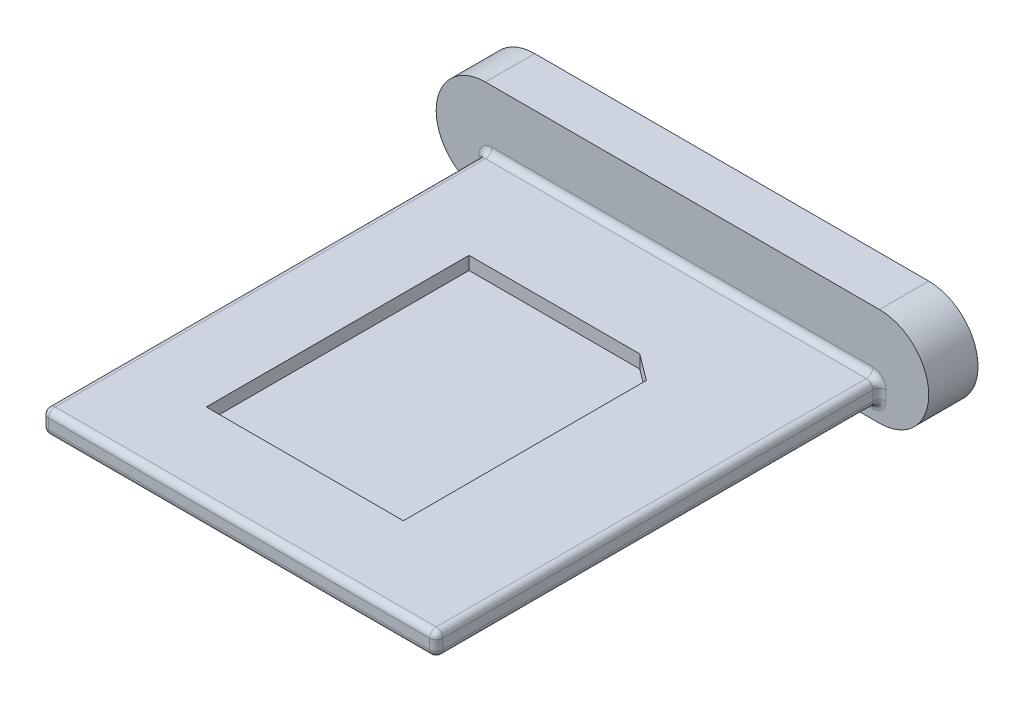
ISO-10303-21;
HEADER;
FILE_DESCRIPTION(('STEP AP214'),'2;1');
FILE_NAME('part.step','',(''),(''),'','','');
FILE_SCHEMA(('AUTOMOTIVE_DESIGN { 1 0 10303 214 1 1 1 1 }'));
ENDSEC;
DATA;
#1=APPLICATION_CONTEXT('core data for automotive mechanical design processes');
#2=APPLICATION_PROTOCOL_DEFINITION('international standard','automotive_design',2000,#1);
#3=PRODUCT_CONTEXT('',#1,'mechanical');
#4=PRODUCT('Part','Part','',(#3));
#5=PRODUCT_RELATED_PRODUCT_CATEGORY('part','',(#4));
#6=PRODUCT_DEFINITION_FORMATION('','',#4);
#7=PRODUCT_DEFINITION_CONTEXT('part definition',#1,'design');
#8=PRODUCT_DEFINITION('design','',#6,#7);
#9=PRODUCT_DEFINITION_SHAPE('','',#8);
#10=(LENGTH_UNIT() NAMED_UNIT(*) SI_UNIT(.MILLI.,.METRE.));
#11=(NAMED_UNIT(*) PLANE_ANGLE_UNIT() SI_UNIT($,.RADIAN.));
#12=(NAMED_UNIT(*) SI_UNIT($,.STERADIAN.) SOLID_ANGLE_UNIT());
#13=UNCERTAINTY_MEASURE_WITH_UNIT(LENGTH_MEASURE(1.E-05),#10,'distance_accuracy_value','');
#14=(GEOMETRIC_REPRESENTATION_CONTEXT(3) GLOBAL_UNCERTAINTY_ASSIGNED_CONTEXT((#13)) GLOBAL_UNIT_ASSIGNED_CONTEXT((#10,
#11,#12)) REPRESENTATION_CONTEXT('',''));
#15=CARTESIAN_POINT('',(0.,0.,0.));
#16=DIRECTION('',(0.,0.,1.));
#17=DIRECTION('',(1.,0.,0.));
#18=AXIS2_PLACEMENT_3D('',#15,#16,#17);
#19=CARTESIAN_POINT('',(-5.3717277486911,0.546879183106835,1.5));
#20=DIRECTION('',(0.,0.,1.));
#21=DIRECTION('',(1.,0.,0.));
#22=AXIS2_PLACEMENT_3D('',#19,#20,#21);
#23=PLANE('',#22);
#24=CARTESIAN_POINT('',(-5.3717277486911,0.546879183106835,1.5));
#25=DIRECTION('',(0.,0.,1.));
#26=DIRECTION('',(1.,0.,0.));
#27=AXIS2_PLACEMENT_3D('',#24,#25,#26);
#28=CIRCLE('',#27,1.5);
#29=CARTESIAN_POINT('',(-5.3717277486911,2.04687918310684,1.5));
#30=VERTEX_POINT('',#29);
#31=CARTESIAN_POINT('',(-5.3717277486911,-0.953120816893165,1.5));
#32=VERTEX_POINT('',#31);
#33=EDGE_CURVE('E265',#30,#32,#28,.T.);
#34=ORIENTED_EDGE('',*,*,#33,.T.);
#35=DIRECTION('',(1.,0.,0.));
#36=VECTOR('',#35,1.);
#37=CARTESIAN_POINT('',(-5.3717277486911,-0.953120816893165,1.5));
#38=LINE('',#37,#36);
#39=CARTESIAN_POINT('',(6.6282722513089,-0.953120816893165,1.5));
#40=VERTEX_POINT('',#39);
#41=EDGE_CURVE('E269',#32,#40,#38,.T.);
#42=ORIENTED_EDGE('',*,*,#41,.T.);
#43=CARTESIAN_POINT('',(6.6282722513089,0.546879183106835,1.5));
#44=DIRECTION('',(0.,0.,-1.));
#45=DIRECTION('',(-1.,0.,0.));
#46=AXIS2_PLACEMENT_3D('',#43,#44,#45);
#47=CIRCLE('',#46,1.5);
#48=CARTESIAN_POINT('',(6.6282722513089,2.04687918310684,1.5));
#49=VERTEX_POINT('',#48);
#50=EDGE_CURVE('E273',#49,#40,#47,.T.);
#51=ORIENTED_EDGE('',*,*,#50,.F.);
#52=DIRECTION('',(1.,0.,0.));
#53=VECTOR('',#52,1.);
#54=CARTESIAN_POINT('',(-5.3717277486911,2.04687918310684,1.5));
#55=LINE('',#54,#53);
#56=EDGE_CURVE('E277',#30,#49,#55,.T.);
#57=ORIENTED_EDGE('',*,*,#56,.F.);
#58=EDGE_LOOP('',(#34,#42,#51,#57));
#59=FACE_BOUND('',#58,.T.);
#60=CARTESIAN_POINT('',(6.4282722513089,0.0270542903007174,1.5));
#61=DIRECTION('',(0.,0.,1.));
#62=DIRECTION('',(1.,0.,0.));
#63=AXIS2_PLACEMENT_3D('',#60,#61,#62);
#64=CIRCLE('',#63,0.4);
#65=CARTESIAN_POINT('',(6.8282722513089,0.0270542903007174,1.5));
#66=VERTEX_POINT('',#65);
#67=CARTESIAN_POINT('',(6.4282722513089,0.427054290300717,1.5));
#68=VERTEX_POINT('',#67);
#69=EDGE_CURVE('E346',#66,#68,#64,.T.);
#70=ORIENTED_EDGE('',*,*,#69,.F.);
#71=DIRECTION('',(0.,1.,0.));
#72=VECTOR('',#71,1.);
#73=CARTESIAN_POINT('',(6.8282722513089,0.546879183106835,1.5));
#74=LINE('',#73,#72);
#75=CARTESIAN_POINT('',(6.8282722513089,-0.272945709699283,1.5));
#76=VERTEX_POINT('',#75);
#77=EDGE_CURVE('E343',#66,#76,#74,.F.);
#78=ORIENTED_EDGE('',*,*,#77,.T.);
#79=CARTESIAN_POINT('',(6.4282722513089,-0.272945709699283,1.5));
#80=DIRECTION('',(0.,0.,1.));
#81=DIRECTION('',(1.,0.,0.));
#82=AXIS2_PLACEMENT_3D('',#79,#80,#81);
#83=CIRCLE('',#82,0.4);
#84=CARTESIAN_POINT('',(6.4282722513089,-0.672945709699283,1.5));
#85=VERTEX_POINT('',#84);
#86=EDGE_CURVE('E339',#85,#76,#83,.T.);
#87=ORIENTED_EDGE('',*,*,#86,.F.);
#88=DIRECTION('',(1.,0.,0.));
#89=VECTOR('',#88,1.);
#90=CARTESIAN_POINT('',(-5.3717277486911,-0.672945709699283,1.5));
#91=LINE('',#90,#89);
#92=CARTESIAN_POINT('',(-5.1717277486911,-0.672945709699283,1.5));
#93=VERTEX_POINT('',#92);
#94=EDGE_CURVE('E332',#85,#93,#91,.F.);
#95=ORIENTED_EDGE('',*,*,#94,.T.);
#96=CARTESIAN_POINT('',(-5.1717277486911,-0.272945709699283,1.5));
#97=DIRECTION('',(0.,0.,1.));
#98=DIRECTION('',(1.,0.,0.));
#99=AXIS2_PLACEMENT_3D('',#96,#97,#98);
#100=CIRCLE('',#99,0.4);
#101=CARTESIAN_POINT('',(-5.5717277486911,-0.272945709699283,1.5));
#102=VERTEX_POINT('',#101);
#103=EDGE_CURVE('E328',#102,#93,#100,.T.);
#104=ORIENTED_EDGE('',*,*,#103,.F.);
#105=DIRECTION('',(0.,-1.,0.));
#106=VECTOR('',#105,1.);
#107=CARTESIAN_POINT('',(-5.5717277486911,0.546879183106835,1.5));
#108=LINE('',#107,#106);
#109=CARTESIAN_POINT('',(-5.5717277486911,0.0270542903007174,1.5));
#110=VERTEX_POINT('',#109);
#111=EDGE_CURVE('E325',#102,#110,#108,.F.);
#112=ORIENTED_EDGE('',*,*,#111,.T.);
#113=CARTESIAN_POINT('',(-5.1717277486911,0.0270542903007174,1.5));
#114=DIRECTION('',(0.,0.,1.));
#115=DIRECTION('',(1.,0.,0.));
#116=AXIS2_PLACEMENT_3D('',#113,#114,#115);
#117=CIRCLE('',#116,0.4);
#118=CARTESIAN_POINT('',(-5.1717277486911,0.427054290300717,1.5));
#119=VERTEX_POINT('',#118);
#120=EDGE_CURVE('E321',#119,#110,#117,.T.);
#121=ORIENTED_EDGE('',*,*,#120,.F.);
#122=DIRECTION('',(-1.,0.,0.));
#123=VECTOR('',#122,1.);
#124=CARTESIAN_POINT('',(-5.3717277486911,0.427054290300717,1.5));
#125=LINE('',#124,#123);
#126=EDGE_CURVE('E335',#119,#68,#125,.F.);
#127=ORIENTED_EDGE('',*,*,#126,.T.);
#128=EDGE_LOOP('',(#70,#78,#87,#95,#104,#112,#121,#127));
#129=FACE_BOUND('',#128,.T.);
#130=ADVANCED_FACE('F42',(#59,#129),#23,.T.);
#131=CARTESIAN_POINT('',(-5.3717277486911,0.227054290300717,15.));
#132=DIRECTION('',(0.,-1.,0.));
#133=DIRECTION('',(0.,0.,-1.));
#134=AXIS2_PLACEMENT_3D('',#131,#132,#133);
#135=PLANE('',#134);
#136=DIRECTION('',(0.,0.,-1.));
#137=VECTOR('',#136,1.);
#138=CARTESIAN_POINT('',(6.4282722513089,0.227054290300717,15.));
#139=LINE('',#138,#137);
#140=CARTESIAN_POINT('',(6.4282722513089,0.227054290300717,14.8));
#141=VERTEX_POINT('',#140);
#142=CARTESIAN_POINT('',(6.4282722513089,0.227054290300717,1.7));
#143=VERTEX_POINT('',#142);
#144=EDGE_CURVE('E314',#141,#143,#139,.T.);
#145=ORIENTED_EDGE('',*,*,#144,.T.);
#146=DIRECTION('',(-1.,0.,0.));
#147=VECTOR('',#146,1.);
#148=CARTESIAN_POINT('',(-5.3717277486911,0.227054290300717,1.7));
#149=LINE('',#148,#147);
#150=CARTESIAN_POINT('',(-5.1717277486911,0.227054290300717,1.7));
#151=VERTEX_POINT('',#150);
#152=EDGE_CURVE('E317',#143,#151,#149,.T.);
#153=ORIENTED_EDGE('',*,*,#152,.T.);
#154=DIRECTION('',(0.,0.,-1.));
#155=VECTOR('',#154,1.);
#156=CARTESIAN_POINT('',(-5.1717277486911,0.227054290300717,15.));
#157=LINE('',#156,#155);
#158=CARTESIAN_POINT('',(-5.1717277486911,0.227054290300717,14.8));
#159=VERTEX_POINT('',#158);
#160=EDGE_CURVE('E308',#151,#159,#157,.F.);
#161=ORIENTED_EDGE('',*,*,#160,.T.);
#162=DIRECTION('',(-1.,0.,0.));
#163=VECTOR('',#162,1.);
#164=CARTESIAN_POINT('',(-5.3717277486911,0.227054290300717,14.8));
#165=LINE('',#164,#163);
#166=EDGE_CURVE('E311',#159,#141,#165,.F.);
#167=ORIENTED_EDGE('',*,*,#166,.T.);
#168=EDGE_LOOP('',(#145,#153,#161,#167));
#169=FACE_BOUND('',#168,.T.);
#170=DIRECTION('',(1.,0.,0.));
#171=VECTOR('',#170,1.);
#172=CARTESIAN_POINT('',(-2.8717277486911,0.227054290300717,4.5));
#173=LINE('',#172,#171);
#174=CARTESIAN_POINT('',(-2.8717277486911,0.227054290300717,4.5));
#175=VERTEX_POINT('',#174);
#176=CARTESIAN_POINT('',(2.3282722513089,0.227054290300717,4.5));
#177=VERTEX_POINT('',#176);
#178=EDGE_CURVE('E239',#175,#177,#173,.T.);
#179=ORIENTED_EDGE('',*,*,#178,.T.);
#180=DIRECTION('',(-0.8,0.,-0.6));
#181=VECTOR('',#180,1.);
#182=CARTESIAN_POINT('',(3.1282722513089,0.227054290300717,5.1));
#183=LINE('',#182,#181);
#184=CARTESIAN_POINT('',(3.1282722513089,0.227054290300717,5.1));
#185=VERTEX_POINT('',#184);
#186=EDGE_CURVE('E218',#185,#177,#183,.T.);
#187=ORIENTED_EDGE('',*,*,#186,.F.);
#188=DIRECTION('',(0.,0.,-1.));
#189=VECTOR('',#188,1.);
#190=CARTESIAN_POINT('',(3.1282722513089,0.227054290300717,12.5));
#191=LINE('',#190,#189);
#192=CARTESIAN_POINT('',(3.1282722513089,0.227054290300717,12.5));
#193=VERTEX_POINT('',#192);
#194=EDGE_CURVE('E242',#193,#185,#191,.T.);
#195=ORIENTED_EDGE('',*,*,#194,.F.);
#196=DIRECTION('',(1.,0.,0.));
#197=VECTOR('',#196,1.);
#198=CARTESIAN_POINT('',(-2.8717277486911,0.227054290300717,12.5));
#199=LINE('',#198,#197);
#200=CARTESIAN_POINT('',(-2.8717277486911,0.227054290300717,12.5));
#201=VERTEX_POINT('',#200);
#202=EDGE_CURVE('E246',#201,#193,#199,.T.);
#203=ORIENTED_EDGE('',*,*,#202,.F.);
#204=DIRECTION('',(0.,0.,1.));
#205=VECTOR('',#204,1.);
#206=CARTESIAN_POINT('',(-2.8717277486911,0.227054290300717,4.5));
#207=LINE('',#206,#205);
#208=EDGE_CURVE('E211',#175,#201,#207,.T.);
#209=ORIENTED_EDGE('',*,*,#208,.F.);
#210=EDGE_LOOP('',(#179,#187,#195,#203,#209));
#211=FACE_BOUND('',#210,.T.);
#212=ADVANCED_FACE('F562',(#169,#211),#135,.F.);
#213=CARTESIAN_POINT('',(-5.3717277486911,0.546879183106835,1.5));
#214=DIRECTION('',(0.,0.,-1.));
#215=DIRECTION('',(-1.,0.,0.));
#216=AXIS2_PLACEMENT_3D('',#213,#214,#215);
#217=CYLINDRICAL_SURFACE('',#216,1.5);
#218=CARTESIAN_POINT('',(-5.3717277486911,0.546879183106835,0.));
#219=DIRECTION('',(0.,0.,1.));
#220=DIRECTION('',(1.,0.,0.));
#221=AXIS2_PLACEMENT_3D('',#218,#219,#220);
#222=CIRCLE('',#221,1.5);
#223=CARTESIAN_POINT('',(-5.3717277486911,2.04687918310684,0.));
#224=VERTEX_POINT('',#223);
#225=CARTESIAN_POINT('',(-5.3717277486911,-0.953120816893165,0.));
#226=VERTEX_POINT('',#225);
#227=EDGE_CURVE('E264',#224,#226,#222,.T.);
#228=ORIENTED_EDGE('',*,*,#227,.T.);
#229=DIRECTION('',(0.,0.,-1.));
#230=VECTOR('',#229,1.);
#231=CARTESIAN_POINT('',(-5.3717277486911,-0.953120816893165,1.5));
#232=LINE('',#231,#230);
#233=EDGE_CURVE('E304',#32,#226,#232,.T.);
#234=ORIENTED_EDGE('',*,*,#233,.F.);
#235=ORIENTED_EDGE('',*,*,#33,.F.);
#236=DIRECTION('',(0.,0.,-1.));
#237=VECTOR('',#236,1.);
#238=CARTESIAN_POINT('',(-5.3717277486911,2.04687918310684,1.5));
#239=LINE('',#238,#237);
#240=EDGE_CURVE('E281',#30,#224,#239,.T.);
#241=ORIENTED_EDGE('',*,*,#240,.T.);
#242=EDGE_LOOP('',(#228,#234,#235,#241));
#243=FACE_BOUND('',#242,.T.);
#244=ADVANCED_FACE('F569',(#243),#217,.T.);
#245=CARTESIAN_POINT('',(-5.3717277486911,-0.953120816893165,1.5));
#246=DIRECTION('',(0.,1.,0.));
#247=DIRECTION('',(0.,0.,1.));
#248=AXIS2_PLACEMENT_3D('',#245,#246,#247);
#249=PLANE('',#248);
#250=DIRECTION('',(1.,0.,0.));
#251=VECTOR('',#250,1.);
#252=CARTESIAN_POINT('',(-5.3717277486911,-0.953120816893165,0.));
#253=LINE('',#252,#251);
#254=CARTESIAN_POINT('',(6.6282722513089,-0.953120816893165,0.));
#255=VERTEX_POINT('',#254);
#256=EDGE_CURVE('E285',#226,#255,#253,.T.);
#257=ORIENTED_EDGE('',*,*,#256,.T.);
#258=DIRECTION('',(0.,0.,-1.));
#259=VECTOR('',#258,1.);
#260=CARTESIAN_POINT('',(6.6282722513089,-0.953120816893165,1.5));
#261=LINE('',#260,#259);
#262=EDGE_CURVE('E301',#40,#255,#261,.T.);
#263=ORIENTED_EDGE('',*,*,#262,.F.);
#264=ORIENTED_EDGE('',*,*,#41,.F.);
#265=ORIENTED_EDGE('',*,*,#233,.T.);
#266=EDGE_LOOP('',(#257,#263,#264,#265));
#267=FACE_BOUND('',#266,.T.);
#268=ADVANCED_FACE('F587',(#267),#249,.F.);
#269=CARTESIAN_POINT('',(6.6282722513089,0.546879183106835,1.5));
#270=DIRECTION('',(0.,0.,-1.));
#271=DIRECTION('',(-1.,0.,0.));
#272=AXIS2_PLACEMENT_3D('',#269,#270,#271);
#273=CYLINDRICAL_SURFACE('',#272,1.5);
#274=CARTESIAN_POINT('',(6.6282722513089,0.546879183106835,0.));
#275=DIRECTION('',(0.,0.,-1.));
#276=DIRECTION('',(-1.,0.,0.));
#277=AXIS2_PLACEMENT_3D('',#274,#275,#276);
#278=CIRCLE('',#277,1.5);
#279=CARTESIAN_POINT('',(6.6282722513089,2.04687918310684,0.));
#280=VERTEX_POINT('',#279);
#281=EDGE_CURVE('E289',#280,#255,#278,.T.);
#282=ORIENTED_EDGE('',*,*,#281,.F.);
#283=DIRECTION('',(0.,0.,-1.));
#284=VECTOR('',#283,1.);
#285=CARTESIAN_POINT('',(6.6282722513089,2.04687918310684,1.5));
#286=LINE('',#285,#284);
#287=EDGE_CURVE('E298',#49,#280,#286,.T.);
#288=ORIENTED_EDGE('',*,*,#287,.F.);
#289=ORIENTED_EDGE('',*,*,#50,.T.);
#290=ORIENTED_EDGE('',*,*,#262,.T.);
#291=EDGE_LOOP('',(#282,#288,#289,#290));
#292=FACE_BOUND('',#291,.T.);
#293=ADVANCED_FACE('F583',(#292),#273,.T.);
#294=CARTESIAN_POINT('',(-5.3717277486911,2.04687918310684,1.5));
#295=DIRECTION('',(0.,1.,0.));
#296=DIRECTION('',(0.,0.,1.));
#297=AXIS2_PLACEMENT_3D('',#294,#295,#296);
#298=PLANE('',#297);
#299=DIRECTION('',(1.,0.,0.));
#300=VECTOR('',#299,1.);
#301=CARTESIAN_POINT('',(-5.3717277486911,2.04687918310684,0.));
#302=LINE('',#301,#300);
#303=EDGE_CURVE('E270',#224,#280,#302,.T.);
#304=ORIENTED_EDGE('',*,*,#303,.F.);
#305=ORIENTED_EDGE('',*,*,#240,.F.);
#306=ORIENTED_EDGE('',*,*,#56,.T.);
#307=ORIENTED_EDGE('',*,*,#287,.T.);
#308=EDGE_LOOP('',(#304,#305,#306,#307));
#309=FACE_BOUND('',#308,.T.);
#310=ADVANCED_FACE('F579',(#309),#298,.T.);
#311=CARTESIAN_POINT('',(-5.3717277486911,0.546879183106835,0.));
#312=DIRECTION('',(0.,0.,1.));
#313=DIRECTION('',(1.,0.,0.));
#314=AXIS2_PLACEMENT_3D('',#311,#312,#313);
#315=PLANE('',#314);
#316=ORIENTED_EDGE('',*,*,#227,.F.);
#317=ORIENTED_EDGE('',*,*,#303,.T.);
#318=ORIENTED_EDGE('',*,*,#281,.T.);
#319=ORIENTED_EDGE('',*,*,#256,.F.);
#320=EDGE_LOOP('',(#316,#317,#318,#319));
#321=FACE_BOUND('',#320,.T.);
#322=ADVANCED_FACE('F575',(#321),#315,.F.);
#323=CARTESIAN_POINT('',(-5.3717277486911,-0.0729457096992826,15.));
#324=DIRECTION('',(1.,0.,0.));
#325=DIRECTION('',(0.,0.,-1.));
#326=AXIS2_PLACEMENT_3D('',#323,#324,#325);
#327=PLANE('',#326);
#328=DIRECTION('',(0.,-1.,0.));
#329=VECTOR('',#328,1.);
#330=CARTESIAN_POINT('',(-5.3717277486911,-0.0729457096992826,14.8));
#331=LINE('',#330,#329);
#332=CARTESIAN_POINT('',(-5.3717277486911,-0.272945709699283,14.8));
#333=VERTEX_POINT('',#332);
#334=CARTESIAN_POINT('',(-5.3717277486911,0.0270542903007174,14.8));
#335=VERTEX_POINT('',#334);
#336=EDGE_CURVE('E52',#333,#335,#331,.F.);
#337=ORIENTED_EDGE('',*,*,#336,.T.);
#338=DIRECTION('',(0.,0.,-1.));
#339=VECTOR('',#338,1.);
#340=CARTESIAN_POINT('',(-5.3717277486911,0.0270542903007174,15.));
#341=LINE('',#340,#339);
#342=CARTESIAN_POINT('',(-5.3717277486911,0.0270542903007174,1.7));
#343=VERTEX_POINT('',#342);
#344=EDGE_CURVE('E11',#335,#343,#341,.T.);
#345=ORIENTED_EDGE('',*,*,#344,.T.);
#346=DIRECTION('',(0.,-1.,0.));
#347=VECTOR('',#346,1.);
#348=CARTESIAN_POINT('',(-5.3717277486911,-0.0729457096992826,1.7));
#349=LINE('',#348,#347);
#350=CARTESIAN_POINT('',(-5.3717277486911,-0.272945709699283,1.7));
#351=VERTEX_POINT('',#350);
#352=EDGE_CURVE('E389',#343,#351,#349,.T.);
#353=ORIENTED_EDGE('',*,*,#352,.T.);
#354=DIRECTION('',(0.,0.,-1.));
#355=VECTOR('',#354,1.);
#356=CARTESIAN_POINT('',(-5.3717277486911,-0.272945709699283,15.));
#357=LINE('',#356,#355);
#358=EDGE_CURVE('E63',#351,#333,#357,.F.);
#359=ORIENTED_EDGE('',*,*,#358,.T.);
#360=EDGE_LOOP('',(#337,#345,#353,#359));
#361=FACE_BOUND('',#360,.T.);
#362=ADVANCED_FACE('F578',(#361),#327,.F.);
#363=CARTESIAN_POINT('',(-5.3717277486911,-0.472945709699283,15.));
#364=DIRECTION('',(0.,1.,0.));
#365=DIRECTION('',(0.,0.,1.));
#366=AXIS2_PLACEMENT_3D('',#363,#364,#365);
#367=PLANE('',#366);
#368=DIRECTION('',(0.,0.,-1.));
#369=VECTOR('',#368,1.);
#370=CARTESIAN_POINT('',(-5.1717277486911,-0.472945709699283,15.));
#371=LINE('',#370,#369);
#372=CARTESIAN_POINT('',(-5.1717277486911,-0.472945709699283,14.8));
#373=VERTEX_POINT('',#372);
#374=CARTESIAN_POINT('',(-5.1717277486911,-0.472945709699283,1.7));
#375=VERTEX_POINT('',#374);
#376=EDGE_CURVE('E350',#373,#375,#371,.T.);
#377=ORIENTED_EDGE('',*,*,#376,.T.);
#378=DIRECTION('',(1.,0.,0.));
#379=VECTOR('',#378,1.);
#380=CARTESIAN_POINT('',(-5.3717277486911,-0.472945709699283,1.7));
#381=LINE('',#380,#379);
#382=CARTESIAN_POINT('',(6.4282722513089,-0.472945709699283,1.7));
#383=VERTEX_POINT('',#382);
#384=EDGE_CURVE('E359',#375,#383,#381,.T.);
#385=ORIENTED_EDGE('',*,*,#384,.T.);
#386=DIRECTION('',(0.,0.,-1.));
#387=VECTOR('',#386,1.);
#388=CARTESIAN_POINT('',(6.4282722513089,-0.472945709699283,15.));
#389=LINE('',#388,#387);
#390=CARTESIAN_POINT('',(6.4282722513089,-0.472945709699283,14.8));
#391=VERTEX_POINT('',#390);
#392=EDGE_CURVE('E356',#383,#391,#389,.F.);
#393=ORIENTED_EDGE('',*,*,#392,.T.);
#394=DIRECTION('',(1.,0.,0.));
#395=VECTOR('',#394,1.);
#396=CARTESIAN_POINT('',(-5.3717277486911,-0.472945709699283,14.8));
#397=LINE('',#396,#395);
#398=EDGE_CURVE('E353',#391,#373,#397,.F.);
#399=ORIENTED_EDGE('',*,*,#398,.T.);
#400=EDGE_LOOP('',(#377,#385,#393,#399));
#401=FACE_BOUND('',#400,.T.);
#402=ADVANCED_FACE('F529',(#401),#367,.F.);
#403=CARTESIAN_POINT('',(6.6282722513089,-0.0729457096992826,15.));
#404=DIRECTION('',(-1.,0.,0.));
#405=DIRECTION('',(0.,0.,1.));
#406=AXIS2_PLACEMENT_3D('',#403,#404,#405);
#407=PLANE('',#406);
#408=DIRECTION('',(0.,0.,-1.));
#409=VECTOR('',#408,1.);
#410=CARTESIAN_POINT('',(6.6282722513089,-0.272945709699283,15.));
#411=LINE('',#410,#409);
#412=CARTESIAN_POINT('',(6.6282722513089,-0.272945709699283,14.8));
#413=VERTEX_POINT('',#412);
#414=CARTESIAN_POINT('',(6.6282722513089,-0.272945709699283,1.7));
#415=VERTEX_POINT('',#414);
#416=EDGE_CURVE('E369',#413,#415,#411,.T.);
#417=ORIENTED_EDGE('',*,*,#416,.T.);
#418=DIRECTION('',(0.,1.,0.));
#419=VECTOR('',#418,1.);
#420=CARTESIAN_POINT('',(6.6282722513089,-0.0729457096992826,1.7));
#421=LINE('',#420,#419);
#422=CARTESIAN_POINT('',(6.6282722513089,0.0270542903007174,1.7));
#423=VERTEX_POINT('',#422);
#424=EDGE_CURVE('E373',#415,#423,#421,.T.);
#425=ORIENTED_EDGE('',*,*,#424,.T.);
#426=DIRECTION('',(0.,0.,-1.));
#427=VECTOR('',#426,1.);
#428=CARTESIAN_POINT('',(6.6282722513089,0.0270542903007174,15.));
#429=LINE('',#428,#427);
#430=CARTESIAN_POINT('',(6.6282722513089,0.0270542903007174,14.8));
#431=VERTEX_POINT('',#430);
#432=EDGE_CURVE('E366',#423,#431,#429,.F.);
#433=ORIENTED_EDGE('',*,*,#432,.T.);
#434=DIRECTION('',(0.,1.,0.));
#435=VECTOR('',#434,1.);
#436=CARTESIAN_POINT('',(6.6282722513089,-0.0729457096992826,14.8));
#437=LINE('',#436,#435);
#438=EDGE_CURVE('E363',#431,#413,#437,.F.);
#439=ORIENTED_EDGE('',*,*,#438,.T.);
#440=EDGE_LOOP('',(#417,#425,#433,#439));
#441=FACE_BOUND('',#440,.T.);
#442=ADVANCED_FACE('F500',(#441),#407,.F.);
#443=CARTESIAN_POINT('',(0.,0.,15.));
#444=DIRECTION('',(0.,0.,-1.));
#445=DIRECTION('',(-1.,0.,0.));
#446=AXIS2_PLACEMENT_3D('',#443,#444,#445);
#447=PLANE('',#446);
#448=DIRECTION('',(1.,0.,0.));
#449=VECTOR('',#448,1.);
#450=CARTESIAN_POINT('',(0.,-0.272945709699283,15.));
#451=LINE('',#450,#449);
#452=CARTESIAN_POINT('',(-5.1717277486911,-0.272945709699283,15.));
#453=VERTEX_POINT('',#452);
#454=CARTESIAN_POINT('',(6.4282722513089,-0.272945709699283,15.));
#455=VERTEX_POINT('',#454);
#456=EDGE_CURVE('E382',#453,#455,#451,.T.);
#457=ORIENTED_EDGE('',*,*,#456,.T.);
#458=DIRECTION('',(0.,1.,0.));
#459=VECTOR('',#458,1.);
#460=CARTESIAN_POINT('',(6.4282722513089,0.,15.));
#461=LINE('',#460,#459);
#462=CARTESIAN_POINT('',(6.4282722513089,0.0270542903007174,15.));
#463=VERTEX_POINT('',#462);
#464=EDGE_CURVE('E386',#455,#463,#461,.T.);
#465=ORIENTED_EDGE('',*,*,#464,.T.);
#466=DIRECTION('',(-1.,0.,0.));
#467=VECTOR('',#466,1.);
#468=CARTESIAN_POINT('',(0.,0.0270542903007174,15.));
#469=LINE('',#468,#467);
#470=CARTESIAN_POINT('',(-5.1717277486911,0.0270542903007174,15.));
#471=VERTEX_POINT('',#470);
#472=EDGE_CURVE('E379',#463,#471,#469,.T.);
#473=ORIENTED_EDGE('',*,*,#472,.T.);
#474=DIRECTION('',(0.,-1.,0.));
#475=VECTOR('',#474,1.);
#476=CARTESIAN_POINT('',(-5.1717277486911,0.,15.));
#477=LINE('',#476,#475);
#478=EDGE_CURVE('E376',#471,#453,#477,.T.);
#479=ORIENTED_EDGE('',*,*,#478,.T.);
#480=EDGE_LOOP('',(#457,#465,#473,#479));
#481=FACE_BOUND('',#480,.T.);
#482=ADVANCED_FACE('F508',(#481),#447,.F.);
#483=CARTESIAN_POINT('',(-2.8717277486911,-0.172945709699283,4.5));
#484=DIRECTION('',(0.,0.,1.));
#485=DIRECTION('',(1.,0.,0.));
#486=AXIS2_PLACEMENT_3D('',#483,#484,#485);
#487=PLANE('',#486);
#488=ORIENTED_EDGE('',*,*,#178,.F.);
#489=DIRECTION('',(0.,1.,0.));
#490=VECTOR('',#489,1.);
#491=CARTESIAN_POINT('',(-2.8717277486911,-0.172945709699283,4.5));
#492=LINE('',#491,#490);
#493=CARTESIAN_POINT('',(-2.8717277486911,-0.172945709699283,4.5));
#494=VERTEX_POINT('',#493);
#495=EDGE_CURVE('E204',#494,#175,#492,.T.);
#496=ORIENTED_EDGE('',*,*,#495,.F.);
#497=DIRECTION('',(1.,0.,0.));
#498=VECTOR('',#497,1.);
#499=CARTESIAN_POINT('',(-2.8717277486911,-0.172945709699283,4.5));
#500=LINE('',#499,#498);
#501=CARTESIAN_POINT('',(2.3282722513089,-0.172945709699283,4.5));
#502=VERTEX_POINT('',#501);
#503=EDGE_CURVE('E198',#494,#502,#500,.T.);
#504=ORIENTED_EDGE('',*,*,#503,.T.);
#505=DIRECTION('',(0.,1.,0.));
#506=VECTOR('',#505,1.);
#507=CARTESIAN_POINT('',(2.3282722513089,-0.172945709699283,4.5));
#508=LINE('',#507,#506);
#509=EDGE_CURVE('E201',#502,#177,#508,.T.);
#510=ORIENTED_EDGE('',*,*,#509,.T.);
#511=EDGE_LOOP('',(#488,#496,#504,#510));
#512=FACE_BOUND('',#511,.T.);
#513=ADVANCED_FACE('F200',(#512),#487,.T.);
#514=CARTESIAN_POINT('',(3.1282722513089,-0.172945709699283,12.5));
#515=DIRECTION('',(1.,0.,0.));
#516=DIRECTION('',(0.,0.,-1.));
#517=AXIS2_PLACEMENT_3D('',#514,#515,#516);
#518=PLANE('',#517);
#519=ORIENTED_EDGE('',*,*,#194,.T.);
#520=DIRECTION('',(0.,1.,0.));
#521=VECTOR('',#520,1.);
#522=CARTESIAN_POINT('',(3.1282722513089,-0.172945709699283,5.1));
#523=LINE('',#522,#521);
#524=CARTESIAN_POINT('',(3.1282722513089,-0.172945709699283,5.1));
#525=VERTEX_POINT('',#524);
#526=EDGE_CURVE('E261',#525,#185,#523,.T.);
#527=ORIENTED_EDGE('',*,*,#526,.F.);
#528=DIRECTION('',(0.,0.,-1.));
#529=VECTOR('',#528,1.);
#530=CARTESIAN_POINT('',(3.1282722513089,-0.172945709699283,12.5));
#531=LINE('',#530,#529);
#532=CARTESIAN_POINT('',(3.1282722513089,-0.172945709699283,12.5));
#533=VERTEX_POINT('',#532);
#534=EDGE_CURVE('E210',#533,#525,#531,.T.);
#535=ORIENTED_EDGE('',*,*,#534,.F.);
#536=DIRECTION('',(0.,1.,0.));
#537=VECTOR('',#536,1.);
#538=CARTESIAN_POINT('',(3.1282722513089,-0.172945709699283,12.5));
#539=LINE('',#538,#537);
#540=EDGE_CURVE('E258',#533,#193,#539,.T.);
#541=ORIENTED_EDGE('',*,*,#540,.T.);
#542=EDGE_LOOP('',(#519,#527,#535,#541));
#543=FACE_BOUND('',#542,.T.);
#544=ADVANCED_FACE('F639',(#543),#518,.F.);
#545=CARTESIAN_POINT('',(-2.8717277486911,-0.172945709699283,12.5));
#546=DIRECTION('',(0.,0.,1.));
#547=DIRECTION('',(1.,0.,0.));
#548=AXIS2_PLACEMENT_3D('',#545,#546,#547);
#549=PLANE('',#548);
#550=ORIENTED_EDGE('',*,*,#202,.T.);
#551=ORIENTED_EDGE('',*,*,#540,.F.);
#552=DIRECTION('',(1.,0.,0.));
#553=VECTOR('',#552,1.);
#554=CARTESIAN_POINT('',(-2.8717277486911,-0.172945709699283,12.5));
#555=LINE('',#554,#553);
#556=CARTESIAN_POINT('',(-2.8717277486911,-0.172945709699283,12.5));
#557=VERTEX_POINT('',#556);
#558=EDGE_CURVE('E233',#557,#533,#555,.T.);
#559=ORIENTED_EDGE('',*,*,#558,.F.);
#560=DIRECTION('',(0.,1.,0.));
#561=VECTOR('',#560,1.);
#562=CARTESIAN_POINT('',(-2.8717277486911,-0.172945709699283,12.5));
#563=LINE('',#562,#561);
#564=EDGE_CURVE('E255',#557,#201,#563,.T.);
#565=ORIENTED_EDGE('',*,*,#564,.T.);
#566=EDGE_LOOP('',(#550,#551,#559,#565));
#567=FACE_BOUND('',#566,.T.);
#568=ADVANCED_FACE('F637',(#567),#549,.F.);
#569=CARTESIAN_POINT('',(-2.8717277486911,-0.172945709699283,4.5));
#570=DIRECTION('',(-1.,0.,0.));
#571=DIRECTION('',(0.,0.,1.));
#572=AXIS2_PLACEMENT_3D('',#569,#570,#571);
#573=PLANE('',#572);
#574=ORIENTED_EDGE('',*,*,#208,.T.);
#575=ORIENTED_EDGE('',*,*,#564,.F.);
#576=DIRECTION('',(0.,0.,1.));
#577=VECTOR('',#576,1.);
#578=CARTESIAN_POINT('',(-2.8717277486911,-0.172945709699283,4.5));
#579=LINE('',#578,#577);
#580=EDGE_CURVE('E236',#494,#557,#579,.T.);
#581=ORIENTED_EDGE('',*,*,#580,.F.);
#582=ORIENTED_EDGE('',*,*,#495,.T.);
#583=EDGE_LOOP('',(#574,#575,#581,#582));
#584=FACE_BOUND('',#583,.T.);
#585=ADVANCED_FACE('F634',(#584),#573,.F.);
#586=CARTESIAN_POINT('',(0.,-0.172945709699283,0.));
#587=DIRECTION('',(0.,1.,0.));
#588=DIRECTION('',(0.,0.,1.));
#589=AXIS2_PLACEMENT_3D('',#586,#587,#588);
#590=PLANE('',#589);
#591=ORIENTED_EDGE('',*,*,#503,.F.);
#592=ORIENTED_EDGE('',*,*,#580,.T.);
#593=ORIENTED_EDGE('',*,*,#558,.T.);
#594=ORIENTED_EDGE('',*,*,#534,.T.);
#595=DIRECTION('',(-0.8,0.,-0.6));
#596=VECTOR('',#595,1.);
#597=CARTESIAN_POINT('',(3.1282722513089,-0.172945709699283,5.1));
#598=LINE('',#597,#596);
#599=EDGE_CURVE('E215',#525,#502,#598,.T.);
#600=ORIENTED_EDGE('',*,*,#599,.T.);
#601=EDGE_LOOP('',(#591,#592,#593,#594,#600));
#602=FACE_BOUND('',#601,.T.);
#603=ADVANCED_FACE('F223',(#602),#590,.T.);
#604=CARTESIAN_POINT('',(0.,-0.272945709699283,14.8));
#605=DIRECTION('',(1.,0.,0.));
#606=DIRECTION('',(0.,0.,-1.));
#607=AXIS2_PLACEMENT_3D('',#604,#605,#606);
#608=CYLINDRICAL_SURFACE('',#607,0.2);
#609=CARTESIAN_POINT('',(6.4282722513089,-0.272945709699283,14.8));
#610=DIRECTION('',(1.,0.,0.));
#611=DIRECTION('',(0.,0.,-1.));
#612=AXIS2_PLACEMENT_3D('',#609,#610,#611);
#613=CIRCLE('',#612,0.2);
#614=EDGE_CURVE('E46',#455,#391,#613,.T.);
#615=ORIENTED_EDGE('',*,*,#614,.F.);
#616=ORIENTED_EDGE('',*,*,#456,.F.);
#617=CARTESIAN_POINT('',(-5.1717277486911,-0.272945709699283,14.8));
#618=DIRECTION('',(-1.,0.,0.));
#619=DIRECTION('',(0.,0.,1.));
#620=AXIS2_PLACEMENT_3D('',#617,#618,#619);
#621=CIRCLE('',#620,0.2);
#622=EDGE_CURVE('E477',#373,#453,#621,.T.);
#623=ORIENTED_EDGE('',*,*,#622,.F.);
#624=ORIENTED_EDGE('',*,*,#398,.F.);
#625=EDGE_LOOP('',(#615,#616,#623,#624));
#626=FACE_BOUND('',#625,.T.);
#627=ADVANCED_FACE('F44',(#626),#608,.T.);
#628=CARTESIAN_POINT('',(6.4282722513089,-0.272945709699283,14.8));
#629=DIRECTION('',(0.,-1.,0.));
#630=DIRECTION('',(0.,0.,-1.));
#631=AXIS2_PLACEMENT_3D('',#628,#629,#630);
#632=SPHERICAL_SURFACE('',#631,0.2);
#633=CARTESIAN_POINT('',(6.4282722513089,-0.272945709699283,14.8));
#634=DIRECTION('',(0.,-1.,0.));
#635=DIRECTION('',(0.,0.,-1.));
#636=AXIS2_PLACEMENT_3D('',#633,#634,#635);
#637=CIRCLE('',#636,0.2);
#638=EDGE_CURVE('E470',#455,#413,#637,.F.);
#639=ORIENTED_EDGE('',*,*,#638,.F.);
#640=ORIENTED_EDGE('',*,*,#614,.T.);
#641=CARTESIAN_POINT('',(6.4282722513089,-0.272945709699283,14.8));
#642=DIRECTION('',(0.,0.,1.));
#643=DIRECTION('',(1.,0.,0.));
#644=AXIS2_PLACEMENT_3D('',#641,#642,#643);
#645=CIRCLE('',#644,0.2);
#646=EDGE_CURVE('E474',#413,#391,#645,.F.);
#647=ORIENTED_EDGE('',*,*,#646,.F.);
#648=EDGE_LOOP('',(#639,#640,#647));
#649=FACE_BOUND('',#648,.T.);
#650=ADVANCED_FACE('F490',(#649),#632,.T.);
#651=CARTESIAN_POINT('',(-5.1717277486911,-0.272945709699283,14.8));
#652=DIRECTION('',(0.,0.,1.));
#653=DIRECTION('',(1.,0.,0.));
#654=AXIS2_PLACEMENT_3D('',#651,#652,#653);
#655=SPHERICAL_SURFACE('',#654,0.2);
#656=CARTESIAN_POINT('',(-5.1717277486911,-0.272945709699283,14.8));
#657=DIRECTION('',(0.,0.,1.));
#658=DIRECTION('',(1.,0.,0.));
#659=AXIS2_PLACEMENT_3D('',#656,#657,#658);
#660=CIRCLE('',#659,0.2);
#661=EDGE_CURVE('E463',#373,#333,#660,.F.);
#662=ORIENTED_EDGE('',*,*,#661,.F.);
#663=ORIENTED_EDGE('',*,*,#622,.T.);
#664=CARTESIAN_POINT('',(-5.1717277486911,-0.272945709699283,14.8));
#665=DIRECTION('',(0.,-1.,0.));
#666=DIRECTION('',(0.,0.,-1.));
#667=AXIS2_PLACEMENT_3D('',#664,#665,#666);
#668=CIRCLE('',#667,0.2);
#669=EDGE_CURVE('E466',#333,#453,#668,.F.);
#670=ORIENTED_EDGE('',*,*,#669,.F.);
#671=EDGE_LOOP('',(#662,#663,#670));
#672=FACE_BOUND('',#671,.T.);
#673=ADVANCED_FACE('F523',(#672),#655,.T.);
#674=CARTESIAN_POINT('',(6.4282722513089,-0.272945709699283,15.));
#675=DIRECTION('',(0.,0.,-1.));
#676=DIRECTION('',(-1.,0.,0.));
#677=AXIS2_PLACEMENT_3D('',#674,#675,#676);
#678=CYLINDRICAL_SURFACE('',#677,0.2);
#679=ORIENTED_EDGE('',*,*,#646,.T.);
#680=ORIENTED_EDGE('',*,*,#392,.F.);
#681=CARTESIAN_POINT('',(6.4282722513089,-0.272945709699283,1.7));
#682=DIRECTION('',(0.,0.,1.));
#683=DIRECTION('',(1.,0.,0.));
#684=AXIS2_PLACEMENT_3D('',#681,#682,#683);
#685=CIRCLE('',#684,0.2);
#686=EDGE_CURVE('E456',#415,#383,#685,.F.);
#687=ORIENTED_EDGE('',*,*,#686,.F.);
#688=ORIENTED_EDGE('',*,*,#416,.F.);
#689=EDGE_LOOP('',(#679,#680,#687,#688));
#690=FACE_BOUND('',#689,.T.);
#691=ADVANCED_FACE('F497',(#690),#678,.T.);
#692=CARTESIAN_POINT('',(6.4282722513089,0.,14.8));
#693=DIRECTION('',(0.,1.,0.));
#694=DIRECTION('',(0.,0.,1.));
#695=AXIS2_PLACEMENT_3D('',#692,#693,#694);
#696=CYLINDRICAL_SURFACE('',#695,0.2);
#697=ORIENTED_EDGE('',*,*,#638,.T.);
#698=ORIENTED_EDGE('',*,*,#438,.F.);
#699=CARTESIAN_POINT('',(6.4282722513089,0.0270542903007174,14.8));
#700=DIRECTION('',(0.,1.,0.));
#701=DIRECTION('',(0.,0.,1.));
#702=AXIS2_PLACEMENT_3D('',#699,#700,#701);
#703=CIRCLE('',#702,0.2);
#704=EDGE_CURVE('E452',#463,#431,#703,.T.);
#705=ORIENTED_EDGE('',*,*,#704,.F.);
#706=ORIENTED_EDGE('',*,*,#464,.F.);
#707=EDGE_LOOP('',(#697,#698,#705,#706));
#708=FACE_BOUND('',#707,.T.);
#709=ADVANCED_FACE('F505',(#708),#696,.T.);
#710=CARTESIAN_POINT('',(0.,0.0270542903007174,14.8));
#711=DIRECTION('',(-1.,0.,0.));
#712=DIRECTION('',(0.,0.,1.));
#713=AXIS2_PLACEMENT_3D('',#710,#711,#712);
#714=CYLINDRICAL_SURFACE('',#713,0.2);
#715=CARTESIAN_POINT('',(-5.1717277486911,0.0270542903007174,14.8));
#716=DIRECTION('',(-1.,0.,0.));
#717=DIRECTION('',(0.,0.,1.));
#718=AXIS2_PLACEMENT_3D('',#715,#716,#717);
#719=CIRCLE('',#718,0.2);
#720=EDGE_CURVE('E444',#471,#159,#719,.T.);
#721=ORIENTED_EDGE('',*,*,#720,.F.);
#722=ORIENTED_EDGE('',*,*,#472,.F.);
#723=CARTESIAN_POINT('',(6.4282722513089,0.0270542903007174,14.8));
#724=DIRECTION('',(1.,0.,0.));
#725=DIRECTION('',(0.,0.,-1.));
#726=AXIS2_PLACEMENT_3D('',#723,#724,#725);
#727=CIRCLE('',#726,0.2);
#728=EDGE_CURVE('E448',#141,#463,#727,.T.);
#729=ORIENTED_EDGE('',*,*,#728,.F.);
#730=ORIENTED_EDGE('',*,*,#166,.F.);
#731=EDGE_LOOP('',(#721,#722,#729,#730));
#732=FACE_BOUND('',#731,.T.);
#733=ADVANCED_FACE('F513',(#732),#714,.T.);
#734=CARTESIAN_POINT('',(-5.1717277486911,0.,14.8));
#735=DIRECTION('',(0.,-1.,0.));
#736=DIRECTION('',(0.,0.,-1.));
#737=AXIS2_PLACEMENT_3D('',#734,#735,#736);
#738=CYLINDRICAL_SURFACE('',#737,0.2);
#739=ORIENTED_EDGE('',*,*,#669,.T.);
#740=ORIENTED_EDGE('',*,*,#478,.F.);
#741=CARTESIAN_POINT('',(-5.1717277486911,0.0270542903007174,14.8));
#742=DIRECTION('',(0.,1.,0.));
#743=DIRECTION('',(0.,0.,1.));
#744=AXIS2_PLACEMENT_3D('',#741,#742,#743);
#745=CIRCLE('',#744,0.2);
#746=EDGE_CURVE('E440',#335,#471,#745,.T.);
#747=ORIENTED_EDGE('',*,*,#746,.F.);
#748=ORIENTED_EDGE('',*,*,#336,.F.);
#749=EDGE_LOOP('',(#739,#740,#747,#748));
#750=FACE_BOUND('',#749,.T.);
#751=ADVANCED_FACE('F521',(#750),#738,.T.);
#752=CARTESIAN_POINT('',(-5.1717277486911,-0.272945709699283,15.));
#753=DIRECTION('',(0.,0.,-1.));
#754=DIRECTION('',(-1.,0.,0.));
#755=AXIS2_PLACEMENT_3D('',#752,#753,#754);
#756=CYLINDRICAL_SURFACE('',#755,0.2);
#757=ORIENTED_EDGE('',*,*,#661,.T.);
#758=ORIENTED_EDGE('',*,*,#358,.F.);
#759=CARTESIAN_POINT('',(-5.1717277486911,-0.272945709699283,1.7));
#760=DIRECTION('',(0.,0.,1.));
#761=DIRECTION('',(1.,0.,0.));
#762=AXIS2_PLACEMENT_3D('',#759,#760,#761);
#763=CIRCLE('',#762,0.2);
#764=EDGE_CURVE('E436',#375,#351,#763,.F.);
#765=ORIENTED_EDGE('',*,*,#764,.F.);
#766=ORIENTED_EDGE('',*,*,#376,.F.);
#767=EDGE_LOOP('',(#757,#758,#765,#766));
#768=FACE_BOUND('',#767,.T.);
#769=ADVANCED_FACE('F526',(#768),#756,.T.);
#770=CARTESIAN_POINT('',(-5.3717277486911,-0.672945709699283,1.7));
#771=DIRECTION('',(1.,0.,0.));
#772=DIRECTION('',(0.,0.,-1.));
#773=AXIS2_PLACEMENT_3D('',#770,#771,#772);
#774=CYLINDRICAL_SURFACE('',#773,0.2);
#775=CARTESIAN_POINT('',(-5.1717277486911,-0.672945709699283,1.7));
#776=DIRECTION('',(1.,0.,0.));
#777=DIRECTION('',(0.,0.,-1.));
#778=AXIS2_PLACEMENT_3D('',#775,#776,#777);
#779=CIRCLE('',#778,0.2);
#780=EDGE_CURVE('E432',#93,#375,#779,.T.);
#781=ORIENTED_EDGE('',*,*,#780,.F.);
#782=ORIENTED_EDGE('',*,*,#94,.F.);
#783=CARTESIAN_POINT('',(6.4282722513089,-0.672945709699283,1.7));
#784=DIRECTION('',(-1.,0.,0.));
#785=DIRECTION('',(0.,0.,1.));
#786=AXIS2_PLACEMENT_3D('',#783,#784,#785);
#787=CIRCLE('',#786,0.2);
#788=EDGE_CURVE('E459',#383,#85,#787,.T.);
#789=ORIENTED_EDGE('',*,*,#788,.F.);
#790=ORIENTED_EDGE('',*,*,#384,.F.);
#791=EDGE_LOOP('',(#781,#782,#789,#790));
#792=FACE_BOUND('',#791,.T.);
#793=ADVANCED_FACE('F533',(#792),#774,.F.);
#794=CARTESIAN_POINT('',(6.4282722513089,-0.272945709699283,1.7));
#795=DIRECTION('',(0.,0.,1.));
#796=DIRECTION('',(1.,0.,0.));
#797=AXIS2_PLACEMENT_3D('',#794,#795,#796);
#798=TOROIDAL_SURFACE('',#797,0.4,0.2);
#799=ORIENTED_EDGE('',*,*,#788,.T.);
#800=ORIENTED_EDGE('',*,*,#86,.T.);
#801=CARTESIAN_POINT('',(6.8282722513089,-0.272945709699283,1.7));
#802=DIRECTION('',(0.,1.,0.));
#803=DIRECTION('',(0.,0.,1.));
#804=AXIS2_PLACEMENT_3D('',#801,#802,#803);
#805=CIRCLE('',#804,0.2);
#806=EDGE_CURVE('E428',#415,#76,#805,.F.);
#807=ORIENTED_EDGE('',*,*,#806,.F.);
#808=ORIENTED_EDGE('',*,*,#686,.T.);
#809=EDGE_LOOP('',(#799,#800,#807,#808));
#810=FACE_BOUND('',#809,.T.);
#811=ADVANCED_FACE('F536',(#810),#798,.F.);
#812=CARTESIAN_POINT('',(6.4282722513089,0.0270542903007174,14.8));
#813=DIRECTION('',(0.,0.,1.));
#814=DIRECTION('',(1.,0.,0.));
#815=AXIS2_PLACEMENT_3D('',#812,#813,#814);
#816=SPHERICAL_SURFACE('',#815,0.2);
#817=ORIENTED_EDGE('',*,*,#728,.T.);
#818=ORIENTED_EDGE('',*,*,#704,.T.);
#819=CARTESIAN_POINT('',(6.4282722513089,0.0270542903007174,14.8));
#820=DIRECTION('',(0.,0.,1.));
#821=DIRECTION('',(1.,0.,0.));
#822=AXIS2_PLACEMENT_3D('',#819,#820,#821);
#823=CIRCLE('',#822,0.2);
#824=EDGE_CURVE('E424',#141,#431,#823,.F.);
#825=ORIENTED_EDGE('',*,*,#824,.F.);
#826=EDGE_LOOP('',(#817,#818,#825));
#827=FACE_BOUND('',#826,.T.);
#828=ADVANCED_FACE('F551',(#827),#816,.T.);
#829=CARTESIAN_POINT('',(-5.1717277486911,0.0270542903007174,14.8));
#830=DIRECTION('',(0.,0.,1.));
#831=DIRECTION('',(1.,0.,0.));
#832=AXIS2_PLACEMENT_3D('',#829,#830,#831);
#833=SPHERICAL_SURFACE('',#832,0.2);
#834=ORIENTED_EDGE('',*,*,#746,.T.);
#835=ORIENTED_EDGE('',*,*,#720,.T.);
#836=CARTESIAN_POINT('',(-5.1717277486911,0.0270542903007174,14.8));
#837=DIRECTION('',(0.,0.,1.));
#838=DIRECTION('',(1.,0.,0.));
#839=AXIS2_PLACEMENT_3D('',#836,#837,#838);
#840=CIRCLE('',#839,0.2);
#841=EDGE_CURVE('E420',#335,#159,#840,.F.);
#842=ORIENTED_EDGE('',*,*,#841,.F.);
#843=EDGE_LOOP('',(#834,#835,#842));
#844=FACE_BOUND('',#843,.T.);
#845=ADVANCED_FACE('F518',(#844),#833,.T.);
#846=CARTESIAN_POINT('',(-5.1717277486911,-0.272945709699283,1.7));
#847=DIRECTION('',(0.,0.,1.));
#848=DIRECTION('',(1.,0.,0.));
#849=AXIS2_PLACEMENT_3D('',#846,#847,#848);
#850=TOROIDAL_SURFACE('',#849,0.4,0.2);
#851=ORIENTED_EDGE('',*,*,#780,.T.);
#852=ORIENTED_EDGE('',*,*,#764,.T.);
#853=CARTESIAN_POINT('',(-5.5717277486911,-0.272945709699283,1.7));
#854=DIRECTION('',(0.,1.,0.));
#855=DIRECTION('',(0.,0.,1.));
#856=AXIS2_PLACEMENT_3D('',#853,#854,#855);
#857=CIRCLE('',#856,0.2);
#858=EDGE_CURVE('E416',#102,#351,#857,.F.);
#859=ORIENTED_EDGE('',*,*,#858,.F.);
#860=ORIENTED_EDGE('',*,*,#103,.T.);
#861=EDGE_LOOP('',(#851,#852,#859,#860));
#862=FACE_BOUND('',#861,.T.);
#863=ADVANCED_FACE('F558',(#862),#850,.F.);
#864=CARTESIAN_POINT('',(6.8282722513089,-0.0729457096992826,1.7));
#865=DIRECTION('',(0.,1.,0.));
#866=DIRECTION('',(0.,0.,1.));
#867=AXIS2_PLACEMENT_3D('',#864,#865,#866);
#868=CYLINDRICAL_SURFACE('',#867,0.2);
#869=ORIENTED_EDGE('',*,*,#806,.T.);
#870=ORIENTED_EDGE('',*,*,#77,.F.);
#871=CARTESIAN_POINT('',(6.8282722513089,0.0270542903007174,1.7));
#872=DIRECTION('',(0.,-1.,0.));
#873=DIRECTION('',(0.,0.,-1.));
#874=AXIS2_PLACEMENT_3D('',#871,#872,#873);
#875=CIRCLE('',#874,0.2);
#876=EDGE_CURVE('E412',#423,#66,#875,.T.);
#877=ORIENTED_EDGE('',*,*,#876,.F.);
#878=ORIENTED_EDGE('',*,*,#424,.F.);
#879=EDGE_LOOP('',(#869,#870,#877,#878));
#880=FACE_BOUND('',#879,.T.);
#881=ADVANCED_FACE('F540',(#880),#868,.F.);
#882=CARTESIAN_POINT('',(6.4282722513089,0.0270542903007174,15.));
#883=DIRECTION('',(0.,0.,-1.));
#884=DIRECTION('',(-1.,0.,0.));
#885=AXIS2_PLACEMENT_3D('',#882,#883,#884);
#886=CYLINDRICAL_SURFACE('',#885,0.2);
#887=ORIENTED_EDGE('',*,*,#824,.T.);
#888=ORIENTED_EDGE('',*,*,#432,.F.);
#889=CARTESIAN_POINT('',(6.4282722513089,0.0270542903007174,1.7));
#890=DIRECTION('',(0.,0.,1.));
#891=DIRECTION('',(1.,0.,0.));
#892=AXIS2_PLACEMENT_3D('',#889,#890,#891);
#893=CIRCLE('',#892,0.2);
#894=EDGE_CURVE('E408',#143,#423,#893,.F.);
#895=ORIENTED_EDGE('',*,*,#894,.F.);
#896=ORIENTED_EDGE('',*,*,#144,.F.);
#897=EDGE_LOOP('',(#887,#888,#895,#896));
#898=FACE_BOUND('',#897,.T.);
#899=ADVANCED_FACE('F549',(#898),#886,.T.);
#900=CARTESIAN_POINT('',(-5.1717277486911,0.0270542903007174,15.));
#901=DIRECTION('',(0.,0.,-1.));
#902=DIRECTION('',(-1.,0.,0.));
#903=AXIS2_PLACEMENT_3D('',#900,#901,#902);
#904=CYLINDRICAL_SURFACE('',#903,0.2);
#905=ORIENTED_EDGE('',*,*,#841,.T.);
#906=ORIENTED_EDGE('',*,*,#160,.F.);
#907=CARTESIAN_POINT('',(-5.1717277486911,0.0270542903007174,1.7));
#908=DIRECTION('',(0.,0.,1.));
#909=DIRECTION('',(1.,0.,0.));
#910=AXIS2_PLACEMENT_3D('',#907,#908,#909);
#911=CIRCLE('',#910,0.2);
#912=EDGE_CURVE('E404',#343,#151,#911,.F.);
#913=ORIENTED_EDGE('',*,*,#912,.F.);
#914=ORIENTED_EDGE('',*,*,#344,.F.);
#915=EDGE_LOOP('',(#905,#906,#913,#914));
#916=FACE_BOUND('',#915,.T.);
#917=ADVANCED_FACE('F608',(#916),#904,.T.);
#918=CARTESIAN_POINT('',(-5.5717277486911,-0.0729457096992826,1.7));
#919=DIRECTION('',(0.,-1.,0.));
#920=DIRECTION('',(0.,0.,-1.));
#921=AXIS2_PLACEMENT_3D('',#918,#919,#920);
#922=CYLINDRICAL_SURFACE('',#921,0.2);
#923=ORIENTED_EDGE('',*,*,#858,.T.);
#924=ORIENTED_EDGE('',*,*,#352,.F.);
#925=CARTESIAN_POINT('',(-5.5717277486911,0.0270542903007174,1.7));
#926=DIRECTION('',(0.,-1.,0.));
#927=DIRECTION('',(0.,0.,-1.));
#928=AXIS2_PLACEMENT_3D('',#925,#926,#927);
#929=CIRCLE('',#928,0.2);
#930=EDGE_CURVE('E401',#110,#343,#929,.T.);
#931=ORIENTED_EDGE('',*,*,#930,.F.);
#932=ORIENTED_EDGE('',*,*,#111,.F.);
#933=EDGE_LOOP('',(#923,#924,#931,#932));
#934=FACE_BOUND('',#933,.T.);
#935=ADVANCED_FACE('F605',(#934),#922,.F.);
#936=CARTESIAN_POINT('',(6.4282722513089,0.0270542903007174,1.7));
#937=DIRECTION('',(0.,0.,1.));
#938=DIRECTION('',(1.,0.,0.));
#939=AXIS2_PLACEMENT_3D('',#936,#937,#938);
#940=TOROIDAL_SURFACE('',#939,0.4,0.2);
#941=ORIENTED_EDGE('',*,*,#876,.T.);
#942=ORIENTED_EDGE('',*,*,#69,.T.);
#943=CARTESIAN_POINT('',(6.4282722513089,0.427054290300717,1.7));
#944=DIRECTION('',(-1.,0.,0.));
#945=DIRECTION('',(0.,0.,1.));
#946=AXIS2_PLACEMENT_3D('',#943,#944,#945);
#947=CIRCLE('',#946,0.2);
#948=EDGE_CURVE('E398',#143,#68,#947,.F.);
#949=ORIENTED_EDGE('',*,*,#948,.F.);
#950=ORIENTED_EDGE('',*,*,#894,.T.);
#951=EDGE_LOOP('',(#941,#942,#949,#950));
#952=FACE_BOUND('',#951,.T.);
#953=ADVANCED_FACE('F545',(#952),#940,.F.);
#954=CARTESIAN_POINT('',(-5.1717277486911,0.0270542903007174,1.7));
#955=DIRECTION('',(0.,0.,1.));
#956=DIRECTION('',(1.,0.,0.));
#957=AXIS2_PLACEMENT_3D('',#954,#955,#956);
#958=TOROIDAL_SURFACE('',#957,0.4,0.2);
#959=ORIENTED_EDGE('',*,*,#930,.T.);
#960=ORIENTED_EDGE('',*,*,#912,.T.);
#961=CARTESIAN_POINT('',(-5.1717277486911,0.427054290300717,1.7));
#962=DIRECTION('',(1.,0.,0.));
#963=DIRECTION('',(0.,0.,-1.));
#964=AXIS2_PLACEMENT_3D('',#961,#962,#963);
#965=CIRCLE('',#964,0.2);
#966=EDGE_CURVE('E220',#119,#151,#965,.F.);
#967=ORIENTED_EDGE('',*,*,#966,.F.);
#968=ORIENTED_EDGE('',*,*,#120,.T.);
#969=EDGE_LOOP('',(#959,#960,#967,#968));
#970=FACE_BOUND('',#969,.T.);
#971=ADVANCED_FACE('F598',(#970),#958,.F.);
#972=CARTESIAN_POINT('',(-5.3717277486911,0.427054290300717,1.7));
#973=DIRECTION('',(-1.,0.,0.));
#974=DIRECTION('',(0.,0.,1.));
#975=AXIS2_PLACEMENT_3D('',#972,#973,#974);
#976=CYLINDRICAL_SURFACE('',#975,0.2);
#977=ORIENTED_EDGE('',*,*,#948,.T.);
#978=ORIENTED_EDGE('',*,*,#126,.F.);
#979=ORIENTED_EDGE('',*,*,#966,.T.);
#980=ORIENTED_EDGE('',*,*,#152,.F.);
#981=EDGE_LOOP('',(#977,#978,#979,#980));
#982=FACE_BOUND('',#981,.T.);
#983=ADVANCED_FACE('F595',(#982),#976,.F.);
#984=CARTESIAN_POINT('',(3.1282722513089,-0.172945709699283,5.1));
#985=DIRECTION('',(0.6,0.,-0.8));
#986=DIRECTION('',(-0.8,0.,-0.6));
#987=AXIS2_PLACEMENT_3D('',#984,#985,#986);
#988=PLANE('',#987);
#989=ORIENTED_EDGE('',*,*,#186,.T.);
#990=ORIENTED_EDGE('',*,*,#509,.F.);
#991=ORIENTED_EDGE('',*,*,#599,.F.);
#992=ORIENTED_EDGE('',*,*,#526,.T.);
#993=EDGE_LOOP('',(#989,#990,#991,#992));
#994=FACE_BOUND('',#993,.T.);
#995=ADVANCED_FACE('F214',(#994),#988,.F.);
#996=CLOSED_SHELL('',(#130,#212,#244,#268,#293,#310,#322,#362,#402,#442,#482,#513,#544,#568,
#585,#603,#627,#650,#673,#691,#709,#733,#751,#769,#793,#811,#828,#845,#863,#881,#899,#917,#935,
#953,#971,#983,#995));
#997=MANIFOLD_SOLID_BREP('B2',#996);
#998=ADVANCED_BREP_SHAPE_REPRESENTATION('',(#18,#997),#14);
#999=SHAPE_DEFINITION_REPRESENTATION(#9,#998);
ENDSEC;
END-ISO-10303-21;
